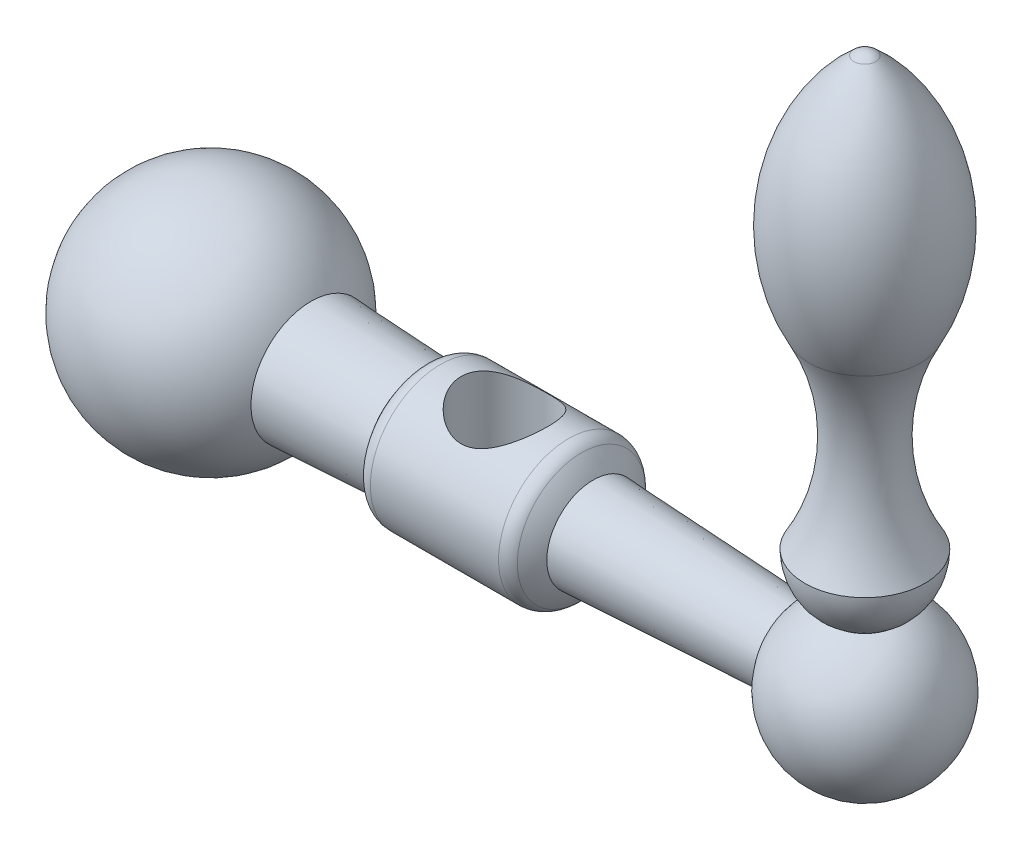
ISO-10303-21;
HEADER;
FILE_DESCRIPTION(('STEP AP214'),'2;1');
FILE_NAME('part.step','',(''),(''),'','','');
FILE_SCHEMA(('AUTOMOTIVE_DESIGN { 1 0 10303 214 1 1 1 1 }'));
ENDSEC;
DATA;
#1=APPLICATION_CONTEXT('core data for automotive mechanical design processes');
#2=APPLICATION_PROTOCOL_DEFINITION('international standard','automotive_design',2000,#1);
#3=PRODUCT_CONTEXT('',#1,'mechanical');
#4=PRODUCT('Part','Part','',(#3));
#5=PRODUCT_RELATED_PRODUCT_CATEGORY('part','',(#4));
#6=PRODUCT_DEFINITION_FORMATION('','',#4);
#7=PRODUCT_DEFINITION_CONTEXT('part definition',#1,'design');
#8=PRODUCT_DEFINITION('design','',#6,#7);
#9=PRODUCT_DEFINITION_SHAPE('','',#8);
#10=(LENGTH_UNIT() NAMED_UNIT(*) SI_UNIT(.MILLI.,.METRE.));
#11=(NAMED_UNIT(*) PLANE_ANGLE_UNIT() SI_UNIT($,.RADIAN.));
#12=(NAMED_UNIT(*) SI_UNIT($,.STERADIAN.) SOLID_ANGLE_UNIT());
#13=UNCERTAINTY_MEASURE_WITH_UNIT(LENGTH_MEASURE(1.E-05),#10,'distance_accuracy_value','');
#14=(GEOMETRIC_REPRESENTATION_CONTEXT(3) GLOBAL_UNCERTAINTY_ASSIGNED_CONTEXT((#13)) GLOBAL_UNIT_ASSIGNED_CONTEXT((#10,
#11,#12)) REPRESENTATION_CONTEXT('',''));
#15=CARTESIAN_POINT('',(0.,0.,0.));
#16=DIRECTION('',(0.,0.,1.));
#17=DIRECTION('',(1.,0.,0.));
#18=AXIS2_PLACEMENT_3D('',#15,#16,#17);
#19=CARTESIAN_POINT('',(59.,0.,0.));
#20=DIRECTION('',(1.,0.,0.));
#21=DIRECTION('',(0.,0.,-1.));
#22=AXIS2_PLACEMENT_3D('',#19,#20,#21);
#23=CYLINDRICAL_SURFACE('',#22,10.5);
#24=CARTESIAN_POINT('',(44.,-8.24621125123532,-6.5));
#25=CARTESIAN_POINT('',(43.8379980188743,-8.24621401991187,-6.49999825627353));
#26=CARTESIAN_POINT('',(43.67595666622,-8.25100603969613,-6.49393136943138));
#27=CARTESIAN_POINT('',(43.3532542932152,-8.2699634040029,-6.46977059674714));
#28=CARTESIAN_POINT('',(43.1925941994986,-8.28413460870234,-6.45166919162623));
#29=CARTESIAN_POINT('',(42.8737250401715,-8.32125973031101,-6.40371407115032));
#30=CARTESIAN_POINT('',(42.7155219066279,-8.34423224134673,-6.37383547076214));
#31=CARTESIAN_POINT('',(42.4029714895653,-8.39802209624007,-6.3027934071083));
#32=CARTESIAN_POINT('',(42.2486261674634,-8.42884334496442,-6.26162432586946));
#33=CARTESIAN_POINT('',(41.9461172998608,-8.49687600869094,-6.1689840563903));
#34=CARTESIAN_POINT('',(41.7979104838218,-8.5340271365491,-6.11760936563425));
#35=CARTESIAN_POINT('',(41.5068208620908,-8.61372921018179,-6.00486778536389));
#36=CARTESIAN_POINT('',(41.363940102934,-8.65628220450855,-5.94349710255254));
#37=CARTESIAN_POINT('',(40.9442140982525,-8.79019432059902,-5.74524861294803));
#38=CARTESIAN_POINT('',(40.6759953585964,-8.88787583798666,-5.59414426089783));
#39=CARTESIAN_POINT('',(40.1319818979779,-9.10446156256927,-5.2352801503978));
#40=CARTESIAN_POINT('',(39.8598162429305,-9.2244683250504,-5.02268658751902));
#41=CARTESIAN_POINT('',(39.4791478969429,-9.40349067632718,-4.67349890843906));
#42=CARTESIAN_POINT('',(39.3567748104676,-9.46304386747304,-4.55195226405779));
#43=CARTESIAN_POINT('',(39.1216816055063,-9.58058478400426,-4.29904811869782));
#44=CARTESIAN_POINT('',(39.0089633388145,-9.63857220762149,-4.16768874464251));
#45=CARTESIAN_POINT('',(38.7811343309393,-9.75838604625804,-3.87956626525839));
#46=CARTESIAN_POINT('',(38.6673106829732,-9.81985807951465,-3.72163454815858));
#47=CARTESIAN_POINT('',(38.4535670657032,-9.93755321238913,-3.39487436109188));
#48=CARTESIAN_POINT('',(38.3536408303658,-9.99377867378188,-3.22605085258338));
#49=CARTESIAN_POINT('',(38.168764010697,-10.0993841088951,-2.87844006810147));
#50=CARTESIAN_POINT('',(38.08380647439,-10.1487672581309,-2.69965746851921));
#51=CARTESIAN_POINT('',(37.9299715736879,-10.2392075476695,-2.33328236086308));
#52=CARTESIAN_POINT('',(37.8610913540014,-10.2802661662178,-2.14569142424701));
#53=CARTESIAN_POINT('',(37.7465562953786,-10.3490908893388,-1.78241309858795));
#54=CARTESIAN_POINT('',(37.69926638695,-10.377776376111,-1.6074148866985));
#55=CARTESIAN_POINT('',(37.6193110288899,-10.4265135362705,-1.25292097528043));
#56=CARTESIAN_POINT('',(37.5866446914058,-10.4465657338149,-1.07342554949377));
#57=CARTESIAN_POINT('',(37.5365018446877,-10.4774242101604,-0.711692069023873));
#58=CARTESIAN_POINT('',(37.5190123733152,-10.4882383787813,-0.529456490245124));
#59=CARTESIAN_POINT('',(37.4994883066961,-10.5003138484556,-0.163851094857709));
#60=CARTESIAN_POINT('',(37.4974519838835,-10.5015762173407,0.0195185926707281));
#61=CARTESIAN_POINT('',(37.5081068867207,-10.4949829749094,0.361375839524498));
#62=CARTESIAN_POINT('',(37.5188880248884,-10.4883098898778,0.519950264092169));
#63=CARTESIAN_POINT('',(37.5519671731413,-10.467901249293,0.835488664683756));
#64=CARTESIAN_POINT('',(37.5742689042163,-10.4541634119304,0.992452103666677));
#65=CARTESIAN_POINT('',(37.6300935672322,-10.4199435094164,1.30355753082128));
#66=CARTESIAN_POINT('',(37.6636125736919,-10.3994638036201,1.45770048614551));
#67=CARTESIAN_POINT('',(37.7414818068123,-10.3522023358701,1.76229212920199));
#68=CARTESIAN_POINT('',(37.7858362182341,-10.3254181391938,1.91273936483777));
#69=CARTESIAN_POINT('',(37.885031476537,-10.266024340067,2.209456261496));
#70=CARTESIAN_POINT('',(37.9399025570738,-10.233397960545,2.35571244545524));
#71=CARTESIAN_POINT('',(38.0595115520393,-10.1630248074604,2.64288118620176));
#72=CARTESIAN_POINT('',(38.1242529651835,-10.1252762187633,2.78379182595949));
#73=CARTESIAN_POINT('',(38.3324360887951,-10.0054152565924,3.197484477063));
#74=CARTESIAN_POINT('',(38.4899066510088,-9.91664478811862,3.46143391518601));
#75=CARTESIAN_POINT('',(38.85932861986,-9.71594170370635,3.99260332823852));
#76=CARTESIAN_POINT('',(39.0756036606733,-9.60250275017354,4.25621315883383));
#77=CARTESIAN_POINT('',(39.5455306255994,-9.37019136234932,4.74583538598213));
#78=CARTESIAN_POINT('',(39.7992360818771,-9.25131131713188,4.97179293079284));
#79=CARTESIAN_POINT('',(40.2219507098378,-9.06944282379994,5.29272932850314));
#80=CARTESIAN_POINT('',(40.3796602948143,-9.00468383159555,5.40186185859395));
#81=CARTESIAN_POINT('',(40.7052398137813,-8.87878916748879,5.6063802120581));
#82=CARTESIAN_POINT('',(40.8731115919796,-8.81765415726534,5.70176352957736));
#83=CARTESIAN_POINT('',(41.2180476599722,-8.70131838427941,5.87777018623488));
#84=CARTESIAN_POINT('',(41.395097707278,-8.64610881262744,5.95841556417005));
#85=CARTESIAN_POINT('',(41.7577437533369,-8.54385761750429,6.10413201608065));
#86=CARTESIAN_POINT('',(41.9433361305005,-8.49681257224537,6.16920961892516));
#87=CARTESIAN_POINT('',(42.2726837983772,-8.4240686265754,6.26799728336329));
#88=CARTESIAN_POINT('',(42.4147981287577,-8.39599841807482,6.30546488661885));
#89=CARTESIAN_POINT('',(42.7023293875016,-8.34649105509251,6.37085343726996));
#90=CARTESIAN_POINT('',(42.847745524705,-8.3250523292463,6.39877664642454));
#91=CARTESIAN_POINT('',(43.1408745106984,-8.28956922307199,6.44467891142459));
#92=CARTESIAN_POINT('',(43.2885846861025,-8.27551681624655,6.46266876263845));
#93=CARTESIAN_POINT('',(43.5854378041596,-8.25529760293418,6.48847692596812));
#94=CARTESIAN_POINT('',(43.7345807714928,-8.24913093252794,6.49629506255516));
#95=CARTESIAN_POINT('',(44.0334755402962,-8.2449224743347,6.50163562717883));
#96=CARTESIAN_POINT('',(44.1832279630475,-8.24689746928543,6.49913678840863));
#97=CARTESIAN_POINT('',(44.4818733019368,-8.25893058329497,6.4838382291818));
#98=CARTESIAN_POINT('',(44.6307662131827,-8.26898874831532,6.47103845015321));
#99=CARTESIAN_POINT('',(44.9266818337997,-8.29680867944639,6.43533034904476));
#100=CARTESIAN_POINT('',(45.0737035472855,-8.31457438454168,6.41241685818759));
#101=CARTESIAN_POINT('',(45.3648699007144,-8.35715739221055,6.35681802752489));
#102=CARTESIAN_POINT('',(45.5090133298124,-8.38197759828188,6.32412866386734));
#103=CARTESIAN_POINT('',(45.9321527218682,-8.46508072996143,6.21296600350431));
#104=CARTESIAN_POINT('',(46.2059310102852,-8.53242849616903,6.12088855461519));
#105=CARTESIAN_POINT('',(46.7346903731131,-8.6841257296935,5.90368048294253));
#106=CARTESIAN_POINT('',(46.989664651967,-8.76848130271656,5.77853798497041));
#107=CARTESIAN_POINT('',(47.5248271336837,-8.9638835663979,5.4715364689505));
#108=CARTESIAN_POINT('',(47.8007284035162,-9.07696562938918,5.283435691238));
#109=CARTESIAN_POINT('',(48.1899318831879,-9.24889208010986,4.97213753286427));
#110=CARTESIAN_POINT('',(48.3156484946296,-9.30663164933319,4.86341551126533));
#111=CARTESIAN_POINT('',(48.5585415308794,-9.42172248569805,4.63651877196199));
#112=CARTESIAN_POINT('',(48.6757163898747,-9.47907367990634,4.5183423294273));
#113=CARTESIAN_POINT('',(48.9182654894804,-9.60087035838565,4.25412395047678));
#114=CARTESIAN_POINT('',(49.0421454151421,-9.66505651370157,4.10658675172539));
#115=CARTESIAN_POINT('',(49.2769594708844,-9.78960682558596,3.80012396525616));
#116=CARTESIAN_POINT('',(49.3878985695189,-9.84997244492751,3.64120278642942));
#117=CARTESIAN_POINT('',(49.5958971547931,-9.96526837034554,3.31266171406678));
#118=CARTESIAN_POINT('',(49.6929579919786,-10.0201992051408,3.14304286387963));
#119=CARTESIAN_POINT('',(49.8721146984782,-10.1230603706026,2.79405185223684));
#120=CARTESIAN_POINT('',(49.9542125042012,-10.1709916069473,2.61468095672756));
#121=CARTESIAN_POINT('',(50.0976352104843,-10.2556336342195,2.25903666148545));
#122=CARTESIAN_POINT('',(50.1599453001586,-10.2928622374569,2.08328443992162));
#123=CARTESIAN_POINT('',(50.2695541928194,-10.3588315828111,1.72559234394429));
#124=CARTESIAN_POINT('',(50.3168534044051,-10.3875725559615,1.54365263810468));
#125=CARTESIAN_POINT('',(50.3956192345213,-10.4356587157646,1.1753617879848));
#126=CARTESIAN_POINT('',(50.4271032254685,-10.4550142111919,0.989015720654637));
#127=CARTESIAN_POINT('',(50.4737424491326,-10.4837493416343,0.613538766748698));
#128=CARTESIAN_POINT('',(50.4889002380532,-10.4931305383286,0.424408320826726));
#129=CARTESIAN_POINT('',(50.5016190698803,-10.5010017070804,0.0727370161630317));
#130=CARTESIAN_POINT('',(50.5014060073087,-10.5008693708711,-0.0896976622185156));
#131=CARTESIAN_POINT('',(50.4888354908576,-10.4930910506607,-0.413915105540586));
#132=CARTESIAN_POINT('',(50.4764785316412,-10.4854453727041,-0.575697896765216));
#133=CARTESIAN_POINT('',(50.4397937684331,-10.4628263968981,-0.897363497872473));
#134=CARTESIAN_POINT('',(50.4154668269888,-10.4478536270337,-1.0572464438064));
#135=CARTESIAN_POINT('',(50.3551693409802,-10.4109370410451,-1.37397791144453));
#136=CARTESIAN_POINT('',(50.3191985246189,-10.388993062196,-1.53082636222554));
#137=CARTESIAN_POINT('',(50.2373162983277,-10.339394804465,-1.83576824942859));
#138=CARTESIAN_POINT('',(50.191738784029,-10.3119335032397,-1.98398298202364));
#139=CARTESIAN_POINT('',(50.090535297607,-10.2514868499727,-2.27579910183524));
#140=CARTESIAN_POINT('',(50.0349060635344,-10.2184997049574,-2.41939897358236));
#141=CARTESIAN_POINT('',(49.8537332365041,-10.1121982648525,-2.84212139362489));
#142=CARTESIAN_POINT('',(49.7138422630189,-10.0315053419283,-3.1133952788527));
#143=CARTESIAN_POINT('',(49.3836688755313,-9.84698961313007,-3.65759430254854));
#144=CARTESIAN_POINT('',(49.1896326020992,-9.74162632332569,-3.92768868150249));
#145=CARTESIAN_POINT('',(48.764696150395,-9.52203534243025,-4.4336114081809));
#146=CARTESIAN_POINT('',(48.5337538060462,-9.40779758970765,-4.66939996479725));
#147=CARTESIAN_POINT('',(48.1453630597357,-9.22867435063609,-5.0101088622034));
#148=CARTESIAN_POINT('',(47.9989368500644,-9.16366000569898,-5.12774924816255));
#149=CARTESIAN_POINT('',(47.6959128953125,-9.03553537758892,-5.3502890894978));
#150=CARTESIAN_POINT('',(47.5393133217876,-8.97242543969398,-5.45518624477397));
#151=CARTESIAN_POINT('',(47.0551952418012,-8.78891701867843,-5.74962915487607));
#152=CARTESIAN_POINT('',(46.7129092310585,-8.67412268538842,-5.91932085782648));
#153=CARTESIAN_POINT('',(46.075085653213,-8.49907792810416,-6.16713678864583));
#154=CARTESIAN_POINT('',(45.7859838022629,-8.43237819597456,-6.25721731370114));
#155=CARTESIAN_POINT('',(45.3419343721982,-8.35341295350167,-6.36178672337956));
#156=CARTESIAN_POINT('',(45.1923440101775,-8.3306178888055,-6.39153637335166));
#157=CARTESIAN_POINT('',(44.8905135901587,-8.29280822406096,-6.4405213049873));
#158=CARTESIAN_POINT('',(44.73827501657,-8.2777894017553,-6.45976229283881));
#159=CARTESIAN_POINT('',(44.4881616880883,-8.26007829081354,-6.48237764439921));
#160=CARTESIAN_POINT('',(44.3907379967751,-8.2548874157793,-6.48898032505708));
#161=CARTESIAN_POINT('',(44.1955476997945,-8.24795267061786,-6.49779252590897));
#162=CARTESIAN_POINT('',(44.0977810215751,-8.24620958011982,-6.50000105247699));
#163=CARTESIAN_POINT('',(44.,-8.24621125123532,-6.5));
#164=B_SPLINE_CURVE_WITH_KNOTS('',3,(#24,#25,#26,#27,#28,#29,#30,#31,#32,#33,#34,#35,#36,#37,
#38,#39,#40,#41,#42,#43,#44,#45,#46,#47,#48,#49,#50,#51,#52,#53,#54,#55,#56,#57,#58,#59,#60,#61,
#62,#63,#64,#65,#66,#67,#68,#69,#70,#71,#72,#73,#74,#75,#76,#77,#78,#79,#80,#81,#82,#83,#84,#85,
#86,#87,#88,#89,#90,#91,#92,#93,#94,#95,#96,#97,#98,#99,#100,#101,#102,#103,#104,#105,#106,#107,
#108,#109,#110,#111,#112,#113,#114,#115,#116,#117,#118,#119,#120,#121,#122,#123,#124,#125,#126,
#127,#128,#129,#130,#131,#132,#133,#134,#135,#136,#137,#138,#139,#140,#141,#142,#143,#144,#145,
#146,#147,#148,#149,#150,#151,#152,#153,#154,#155,#156,#157,#158,#159,#160,#161,#162,#163),
.UNSPECIFIED.,.T.,.F.,(4,2,2,2,2,2,2,2,2,2,2,2,2,2,2,2,2,2,2,2,2,2,2,2,2,2,2,2,2,2,2,2,2,2,2,2,
2,2,2,2,2,2,2,2,2,2,2,2,2,2,2,2,2,2,2,2,2,2,2,2,2,2,2,2,2,2,2,2,2,4),(0.,0.485892760641778,
0.972089397263516,1.45931891494719,1.94679131195436,2.42985686874325,2.91310616905004,
3.87868062660727,4.97103169755911,5.51801743508842,6.06510785064015,6.67675303831126,
7.2881215484948,7.89920536545697,8.51018057274444,9.05997194158135,9.60972992595574,
10.159017913922,10.7082444940003,11.1849138690921,11.6617372980551,12.138394037031,
12.6152351583059,13.0934682569113,13.5718712696045,14.5280169951178,15.6020648803689,
16.6776640095516,17.2843115738561,17.8910695629147,18.4969126591456,19.1025012275409,
19.550941260889,19.9992749524819,20.4471204404311,20.8949736565491,21.343750511399,
21.7925299180475,22.2415389467717,22.6907330473074,23.5768832674901,24.4633521788292,
25.5166695514532,26.0441683146141,26.5717635331556,27.1801927787996,27.7883876473303,
28.3965232897948,29.0045801757132,29.5741926647196,30.143789647426,30.7127595738238,
31.2816404032845,31.7683324521798,32.2550046772381,32.7416418382128,33.2282903593211,
33.7002066330159,34.1722763272953,35.115703430024,36.1584177367208,37.2023320009071,
37.7980034049684,38.3937821659889,39.5834565922613,40.5096501838293,40.9717990289423,
41.4336966777902,41.7269051336823,42.0201798836659),.UNSPECIFIED.);
#165=CARTESIAN_POINT('',(44.,-8.24621125123532,-6.5));
#166=VERTEX_POINT('',#165);
#167=EDGE_CURVE('E62',#166,#166,#164,.T.);
#168=ORIENTED_EDGE('',*,*,#167,.T.);
#169=EDGE_LOOP('',(#168));
#170=FACE_BOUND('',#169,.T.);
#171=CARTESIAN_POINT('',(34.3953136438507,0.,0.));
#172=DIRECTION('',(1.,0.,0.));
#173=DIRECTION('',(0.,0.,-1.));
#174=AXIS2_PLACEMENT_3D('',#171,#172,#173);
#175=CIRCLE('',#174,10.5);
#176=CARTESIAN_POINT('',(34.3953136438507,0.,-10.5));
#177=VERTEX_POINT('',#176);
#178=EDGE_CURVE('E123',#177,#177,#175,.T.);
#179=ORIENTED_EDGE('',*,*,#178,.T.);
#180=EDGE_LOOP('',(#179));
#181=FACE_BOUND('',#180,.T.);
#182=CARTESIAN_POINT('',(53.6046863561493,0.,0.));
#183=DIRECTION('',(1.,0.,0.));
#184=DIRECTION('',(0.,0.,-1.));
#185=AXIS2_PLACEMENT_3D('',#182,#183,#184);
#186=CIRCLE('',#185,10.5);
#187=CARTESIAN_POINT('',(53.6046863561493,0.,-10.5));
#188=VERTEX_POINT('',#187);
#189=EDGE_CURVE('E126',#188,#188,#186,.T.);
#190=ORIENTED_EDGE('',*,*,#189,.F.);
#191=EDGE_LOOP('',(#190));
#192=FACE_BOUND('',#191,.T.);
#193=CARTESIAN_POINT('',(44.,8.24621125123532,-6.5));
#194=CARTESIAN_POINT('',(44.1620019811257,8.24621401991187,-6.49999825627353));
#195=CARTESIAN_POINT('',(44.32404333378,8.25100603969613,-6.49393136943138));
#196=CARTESIAN_POINT('',(44.6467457067848,8.2699634040029,-6.46977059674714));
#197=CARTESIAN_POINT('',(44.8074058005014,8.28413460870234,-6.45166919162623));
#198=CARTESIAN_POINT('',(45.1262749598285,8.32125973031101,-6.40371407115032));
#199=CARTESIAN_POINT('',(45.2844780933721,8.34423224134673,-6.37383547076214));
#200=CARTESIAN_POINT('',(45.5970285104347,8.39802209624007,-6.3027934071083));
#201=CARTESIAN_POINT('',(45.7513738325366,8.42884334496442,-6.26162432586946));
#202=CARTESIAN_POINT('',(46.0538827001392,8.49687600869094,-6.1689840563903));
#203=CARTESIAN_POINT('',(46.2020895161782,8.5340271365491,-6.11760936563425));
#204=CARTESIAN_POINT('',(46.4931791379092,8.61372921018179,-6.00486778536389));
#205=CARTESIAN_POINT('',(46.636059897066,8.65628220450855,-5.94349710255254));
#206=CARTESIAN_POINT('',(47.0557859017475,8.79019432059902,-5.74524861294803));
#207=CARTESIAN_POINT('',(47.3240046414036,8.88787583798666,-5.59414426089783));
#208=CARTESIAN_POINT('',(47.8680181020221,9.10446156256927,-5.2352801503978));
#209=CARTESIAN_POINT('',(48.1401837570695,9.2244683250504,-5.02268658751902));
#210=CARTESIAN_POINT('',(48.5208521030571,9.40349067632718,-4.67349890843906));
#211=CARTESIAN_POINT('',(48.6432251895324,9.46304386747305,-4.55195226405779));
#212=CARTESIAN_POINT('',(48.8783183944937,9.58058478400426,-4.29904811869781));
#213=CARTESIAN_POINT('',(48.9910366611855,9.63857220762149,-4.16768874464251));
#214=CARTESIAN_POINT('',(49.2188656690606,9.75838604625804,-3.87956626525839));
#215=CARTESIAN_POINT('',(49.3326893170268,9.81985807951465,-3.72163454815858));
#216=CARTESIAN_POINT('',(49.5464329342967,9.93755321238913,-3.39487436109188));
#217=CARTESIAN_POINT('',(49.6463591696342,9.99377867378188,-3.22605085258338));
#218=CARTESIAN_POINT('',(49.831235989303,10.0993841088951,-2.87844006810147));
#219=CARTESIAN_POINT('',(49.91619352561,10.1487672581309,-2.69965746851921));
#220=CARTESIAN_POINT('',(50.0700284263121,10.2392075476695,-2.33328236086308));
#221=CARTESIAN_POINT('',(50.1389086459986,10.2802661662178,-2.14569142424701));
#222=CARTESIAN_POINT('',(50.2534437046214,10.3490908893388,-1.78241309858795));
#223=CARTESIAN_POINT('',(50.30073361305,10.377776376111,-1.6074148866985));
#224=CARTESIAN_POINT('',(50.38068897111,10.4265135362705,-1.25292097528043));
#225=CARTESIAN_POINT('',(50.4133553085942,10.4465657338149,-1.07342554949377));
#226=CARTESIAN_POINT('',(50.4634981553123,10.4774242101604,-0.711692069023872));
#227=CARTESIAN_POINT('',(50.4809876266848,10.4882383787813,-0.529456490245123));
#228=CARTESIAN_POINT('',(50.5005116933038,10.5003138484556,-0.163851094857709));
#229=CARTESIAN_POINT('',(50.5025480161165,10.5015762173407,0.0195185926707282));
#230=CARTESIAN_POINT('',(50.4918931132793,10.4949829749094,0.361375839524498));
#231=CARTESIAN_POINT('',(50.4811119751116,10.4883098898778,0.519950264092169));
#232=CARTESIAN_POINT('',(50.4480328268587,10.467901249293,0.835488664683755));
#233=CARTESIAN_POINT('',(50.4257310957837,10.4541634119304,0.992452103666676));
#234=CARTESIAN_POINT('',(50.3699064327678,10.4199435094164,1.30355753082128));
#235=CARTESIAN_POINT('',(50.3363874263081,10.3994638036201,1.45770048614551));
#236=CARTESIAN_POINT('',(50.2585181931877,10.3522023358701,1.76229212920199));
#237=CARTESIAN_POINT('',(50.2141637817659,10.3254181391938,1.91273936483777));
#238=CARTESIAN_POINT('',(50.114968523463,10.266024340067,2.209456261496));
#239=CARTESIAN_POINT('',(50.0600974429262,10.233397960545,2.35571244545524));
#240=CARTESIAN_POINT('',(49.9404884479607,10.1630248074604,2.64288118620176));
#241=CARTESIAN_POINT('',(49.8757470348165,10.1252762187633,2.78379182595949));
#242=CARTESIAN_POINT('',(49.6675639112049,10.0054152565924,3.197484477063));
#243=CARTESIAN_POINT('',(49.5100933489912,9.91664478811862,3.46143391518601));
#244=CARTESIAN_POINT('',(49.14067138014,9.71594170370635,3.99260332823852));
#245=CARTESIAN_POINT('',(48.9243963393267,9.60250275017354,4.25621315883383));
#246=CARTESIAN_POINT('',(48.4544693744006,9.37019136234932,4.74583538598213));
#247=CARTESIAN_POINT('',(48.2007639181229,9.25131131713188,4.97179293079284));
#248=CARTESIAN_POINT('',(47.7780492901622,9.06944282379994,5.29272932850314));
#249=CARTESIAN_POINT('',(47.6203397051857,9.00468383159555,5.40186185859395));
#250=CARTESIAN_POINT('',(47.2947601862187,8.87878916748879,5.6063802120581));
#251=CARTESIAN_POINT('',(47.1268884080204,8.81765415726534,5.70176352957736));
#252=CARTESIAN_POINT('',(46.7819523400278,8.70131838427941,5.87777018623488));
#253=CARTESIAN_POINT('',(46.604902292722,8.64610881262744,5.95841556417005));
#254=CARTESIAN_POINT('',(46.2422562466631,8.54385761750428,6.10413201608066));
#255=CARTESIAN_POINT('',(46.0566638694995,8.49681257224537,6.16920961892516));
#256=CARTESIAN_POINT('',(45.7273162016228,8.4240686265754,6.26799728336329));
#257=CARTESIAN_POINT('',(45.5852018712423,8.39599841807482,6.30546488661885));
#258=CARTESIAN_POINT('',(45.2976706124984,8.34649105509251,6.37085343726996));
#259=CARTESIAN_POINT('',(45.152254475295,8.3250523292463,6.39877664642454));
#260=CARTESIAN_POINT('',(44.8591254893016,8.28956922307199,6.44467891142459));
#261=CARTESIAN_POINT('',(44.7114153138975,8.27551681624655,6.46266876263845));
#262=CARTESIAN_POINT('',(44.4145621958404,8.25529760293418,6.48847692596812));
#263=CARTESIAN_POINT('',(44.2654192285072,8.24913093252794,6.49629506255516));
#264=CARTESIAN_POINT('',(43.9665244597038,8.2449224743347,6.50163562717883));
#265=CARTESIAN_POINT('',(43.8167720369525,8.24689746928543,6.49913678840863));
#266=CARTESIAN_POINT('',(43.5181266980632,8.25893058329497,6.4838382291818));
#267=CARTESIAN_POINT('',(43.3692337868173,8.26898874831532,6.47103845015321));
#268=CARTESIAN_POINT('',(43.0733181662003,8.29680867944639,6.43533034904476));
#269=CARTESIAN_POINT('',(42.9262964527145,8.31457438454168,6.41241685818759));
#270=CARTESIAN_POINT('',(42.6351300992856,8.35715739221055,6.35681802752489));
#271=CARTESIAN_POINT('',(42.4909866701877,8.38197759828188,6.32412866386734));
#272=CARTESIAN_POINT('',(42.0678472781318,8.46508072996143,6.21296600350431));
#273=CARTESIAN_POINT('',(41.7940689897148,8.53242849616903,6.12088855461519));
#274=CARTESIAN_POINT('',(41.2653096268869,8.6841257296935,5.90368048294253));
#275=CARTESIAN_POINT('',(41.010335348033,8.76848130271656,5.77853798497041));
#276=CARTESIAN_POINT('',(40.4751728663163,8.9638835663979,5.4715364689505));
#277=CARTESIAN_POINT('',(40.1992715964838,9.07696562938918,5.283435691238));
#278=CARTESIAN_POINT('',(39.8100681168121,9.24889208010986,4.97213753286427));
#279=CARTESIAN_POINT('',(39.6843515053704,9.30663164933319,4.86341551126533));
#280=CARTESIAN_POINT('',(39.4414584691206,9.42172248569805,4.63651877196199));
#281=CARTESIAN_POINT('',(39.3242836101253,9.47907367990634,4.5183423294273));
#282=CARTESIAN_POINT('',(39.0817345105196,9.60087035838565,4.25412395047679));
#283=CARTESIAN_POINT('',(38.9578545848579,9.66505651370157,4.10658675172539));
#284=CARTESIAN_POINT('',(38.7230405291156,9.78960682558596,3.80012396525617));
#285=CARTESIAN_POINT('',(38.6121014304811,9.84997244492751,3.64120278642942));
#286=CARTESIAN_POINT('',(38.4041028452069,9.96526837034554,3.31266171406678));
#287=CARTESIAN_POINT('',(38.3070420080214,10.0201992051408,3.14304286387963));
#288=CARTESIAN_POINT('',(38.1278853015218,10.1230603706026,2.79405185223684));
#289=CARTESIAN_POINT('',(38.0457874957988,10.1709916069473,2.61468095672756));
#290=CARTESIAN_POINT('',(37.9023647895157,10.2556336342195,2.25903666148545));
#291=CARTESIAN_POINT('',(37.8400546998414,10.2928622374569,2.08328443992162));
#292=CARTESIAN_POINT('',(37.7304458071806,10.3588315828111,1.72559234394429));
#293=CARTESIAN_POINT('',(37.6831465955949,10.3875725559615,1.54365263810468));
#294=CARTESIAN_POINT('',(37.6043807654787,10.4356587157646,1.1753617879848));
#295=CARTESIAN_POINT('',(37.5728967745315,10.4550142111919,0.989015720654636));
#296=CARTESIAN_POINT('',(37.5262575508674,10.4837493416343,0.613538766748697));
#297=CARTESIAN_POINT('',(37.5110997619468,10.4931305383286,0.424408320826725));
#298=CARTESIAN_POINT('',(37.4983809301197,10.5010017070804,0.0727370161630339));
#299=CARTESIAN_POINT('',(37.4985939926913,10.5008693708711,-0.0896976622185112));
#300=CARTESIAN_POINT('',(37.5111645091424,10.4930910506607,-0.413915105540581));
#301=CARTESIAN_POINT('',(37.5235214683588,10.4854453727041,-0.575697896765214));
#302=CARTESIAN_POINT('',(37.5602062315669,10.4628263968981,-0.897363497872473));
#303=CARTESIAN_POINT('',(37.5845331730112,10.4478536270337,-1.0572464438064));
#304=CARTESIAN_POINT('',(37.6448306590198,10.4109370410451,-1.37397791144453));
#305=CARTESIAN_POINT('',(37.680801475381,10.388993062196,-1.53082636222554));
#306=CARTESIAN_POINT('',(37.7626837016723,10.339394804465,-1.83576824942859));
#307=CARTESIAN_POINT('',(37.808261215971,10.3119335032397,-1.98398298202364));
#308=CARTESIAN_POINT('',(37.909464702393,10.2514868499727,-2.27579910183524));
#309=CARTESIAN_POINT('',(37.9650939364656,10.2184997049574,-2.41939897358236));
#310=CARTESIAN_POINT('',(38.1462667634959,10.1121982648525,-2.84212139362489));
#311=CARTESIAN_POINT('',(38.286157736981,10.0315053419283,-3.1133952788527));
#312=CARTESIAN_POINT('',(38.6163311244687,9.84698961313007,-3.65759430254854));
#313=CARTESIAN_POINT('',(38.8103673979008,9.74162632332568,-3.92768868150249));
#314=CARTESIAN_POINT('',(39.235303849605,9.52203534243024,-4.4336114081809));
#315=CARTESIAN_POINT('',(39.4662461939538,9.40779758970765,-4.66939996479725));
#316=CARTESIAN_POINT('',(39.8546369402643,9.22867435063609,-5.0101088622034));
#317=CARTESIAN_POINT('',(40.0010631499355,9.16366000569898,-5.12774924816255));
#318=CARTESIAN_POINT('',(40.3040871046875,9.03553537758892,-5.3502890894978));
#319=CARTESIAN_POINT('',(40.4606866782124,8.97242543969398,-5.45518624477397));
#320=CARTESIAN_POINT('',(40.9448047581988,8.78891701867843,-5.74962915487607));
#321=CARTESIAN_POINT('',(41.2870907689415,8.67412268538842,-5.91932085782648));
#322=CARTESIAN_POINT('',(41.924914346787,8.49907792810416,-6.16713678864583));
#323=CARTESIAN_POINT('',(42.2140161977371,8.43237819597456,-6.25721731370114));
#324=CARTESIAN_POINT('',(42.6580656278018,8.35341295350167,-6.36178672337956));
#325=CARTESIAN_POINT('',(42.8076559898225,8.3306178888055,-6.39153637335166));
#326=CARTESIAN_POINT('',(43.1094864098413,8.29280822406096,-6.4405213049873));
#327=CARTESIAN_POINT('',(43.26172498343,8.2777894017553,-6.45976229283881));
#328=CARTESIAN_POINT('',(43.5118383119117,8.26007829081354,-6.48237764439921));
#329=CARTESIAN_POINT('',(43.6092620032249,8.2548874157793,-6.48898032505708));
#330=CARTESIAN_POINT('',(43.8044523002055,8.24795267061786,-6.49779252590897));
#331=CARTESIAN_POINT('',(43.9022189784249,8.24620958011982,-6.50000105247699));
#332=CARTESIAN_POINT('',(44.,8.24621125123532,-6.5));
#333=B_SPLINE_CURVE_WITH_KNOTS('',3,(#193,#194,#195,#196,#197,#198,#199,#200,#201,#202,#203,
#204,#205,#206,#207,#208,#209,#210,#211,#212,#213,#214,#215,#216,#217,#218,#219,#220,#221,#222,
#223,#224,#225,#226,#227,#228,#229,#230,#231,#232,#233,#234,#235,#236,#237,#238,#239,#240,#241,
#242,#243,#244,#245,#246,#247,#248,#249,#250,#251,#252,#253,#254,#255,#256,#257,#258,#259,#260,
#261,#262,#263,#264,#265,#266,#267,#268,#269,#270,#271,#272,#273,#274,#275,#276,#277,#278,#279,
#280,#281,#282,#283,#284,#285,#286,#287,#288,#289,#290,#291,#292,#293,#294,#295,#296,#297,#298,
#299,#300,#301,#302,#303,#304,#305,#306,#307,#308,#309,#310,#311,#312,#313,#314,#315,#316,#317,
#318,#319,#320,#321,#322,#323,#324,#325,#326,#327,#328,#329,#330,#331,#332),.UNSPECIFIED.,.T.,
.F.,(4,2,2,2,2,2,2,2,2,2,2,2,2,2,2,2,2,2,2,2,2,2,2,2,2,2,2,2,2,2,2,2,2,2,2,2,2,2,2,2,2,2,2,2,2,
2,2,2,2,2,2,2,2,2,2,2,2,2,2,2,2,2,2,2,2,2,2,2,2,4),(0.,0.485892760641778,0.972089397263516,
1.45931891494719,1.94679131195436,2.42985686874325,2.91310616905004,3.87868062660727,
4.97103169755911,5.51801743508843,6.06510785064015,6.67675303831126,7.2881215484948,
7.89920536545697,8.51018057274444,9.05997194158135,9.60972992595574,10.159017913922,
10.7082444940003,11.1849138690921,11.6617372980551,12.138394037031,12.6152351583059,
13.0934682569113,13.5718712696045,14.5280169951178,15.6020648803689,16.6776640095516,
17.2843115738561,17.8910695629147,18.4969126591456,19.1025012275409,19.550941260889,
19.9992749524819,20.4471204404311,20.8949736565491,21.343750511399,21.7925299180475,
22.2415389467716,22.6907330473074,23.5768832674901,24.4633521788292,25.5166695514532,
26.0441683146141,26.5717635331556,27.1801927787996,27.7883876473303,28.3965232897948,
29.0045801757132,29.5741926647196,30.143789647426,30.7127595738238,31.2816404032845,
31.7683324521798,32.2550046772381,32.7416418382128,33.2282903593211,33.7002066330159,
34.1722763272953,35.115703430024,36.1584177367208,37.2023320009071,37.7980034049684,
38.393782165989,39.5834565922613,40.5096501838293,40.9717990289423,41.4336966777902,
41.7269051336823,42.0201798836659),.UNSPECIFIED.);
#334=CARTESIAN_POINT('',(44.,8.24621125123532,-6.5));
#335=VERTEX_POINT('',#334);
#336=EDGE_CURVE('E41',#335,#335,#333,.T.);
#337=ORIENTED_EDGE('',*,*,#336,.T.);
#338=EDGE_LOOP('',(#337));
#339=FACE_BOUND('',#338,.T.);
#340=ADVANCED_FACE('F40',(#170,#181,#192,#339),#23,.T.);
#341=CARTESIAN_POINT('',(87.3346354961492,0.,0.));
#342=DIRECTION('',(-1.,0.,0.));
#343=DIRECTION('',(0.,0.,1.));
#344=AXIS2_PLACEMENT_3D('',#341,#342,#343);
#345=CONICAL_SURFACE('',#344,5.5,0.0483540780497947);
#346=CARTESIAN_POINT('',(57.2907326214615,0.,0.));
#347=DIRECTION('',(-1.,0.,0.));
#348=DIRECTION('',(0.,0.,1.));
#349=AXIS2_PLACEMENT_3D('',#346,#347,#348);
#350=CIRCLE('',#349,6.95387851380956);
#351=CARTESIAN_POINT('',(57.2907326214615,-6.95387851380934,0.));
#352=VERTEX_POINT('',#351);
#353=EDGE_CURVE('E10',#352,#352,#350,.T.);
#354=ORIENTED_EDGE('',*,*,#353,.F.);
#355=EDGE_LOOP('',(#354));
#356=FACE_BOUND('',#355,.T.);
#357=CARTESIAN_POINT('',(87.3346354961492,0.,0.));
#358=DIRECTION('',(1.,0.,0.));
#359=DIRECTION('',(0.,0.,-1.));
#360=AXIS2_PLACEMENT_3D('',#357,#358,#359);
#361=CIRCLE('',#360,5.5);
#362=CARTESIAN_POINT('',(87.3346354961492,0.,-5.5));
#363=VERTEX_POINT('',#362);
#364=EDGE_CURVE('E54',#363,#363,#361,.T.);
#365=ORIENTED_EDGE('',*,*,#364,.F.);
#366=EDGE_LOOP('',(#365));
#367=FACE_BOUND('',#366,.T.);
#368=ADVANCED_FACE('F114',(#356,#367),#345,.T.);
#369=CARTESIAN_POINT('',(44.,0.,0.));
#370=DIRECTION('',(1.,0.,0.));
#371=DIRECTION('',(0.,-1.,0.));
#372=AXIS2_PLACEMENT_3D('',#369,#370,#371);
#373=SPHERICAL_SURFACE('',#372,15.);
#374=CARTESIAN_POINT('',(55.5256236273791,0.,0.));
#375=DIRECTION('',(1.,0.,0.));
#376=DIRECTION('',(0.,0.,-1.));
#377=AXIS2_PLACEMENT_3D('',#374,#375,#376);
#378=CIRCLE('',#377,9.6);
#379=CARTESIAN_POINT('',(55.5256236273791,-9.6,0.));
#380=VERTEX_POINT('',#379);
#381=EDGE_CURVE('E145',#380,#380,#378,.T.);
#382=CARTESIAN_POINT('',(57.2907326214615,-6.95387851380934,0.));
#383=CARTESIAN_POINT('',(57.2753432910655,-6.9832916681052,0.));
#384=CARTESIAN_POINT('',(57.25985631815,-7.01265373458386,0.));
#385=CARTESIAN_POINT('',(57.2286877766869,-7.07127440126945,0.));
#386=CARTESIAN_POINT('',(57.2130062081391,-7.10053300147638,0.));
#387=CARTESIAN_POINT('',(57.1814491648178,-7.15894544498116,0.));
#388=CARTESIAN_POINT('',(57.1655736900442,-7.18809928827902,0.));
#389=CARTESIAN_POINT('',(57.1336295345231,-7.24630093316788,0.));
#390=CARTESIAN_POINT('',(57.1175608537756,-7.27534873475889,0.));
#391=CARTESIAN_POINT('',(57.0852309944591,-7.33333701578296,0.));
#392=CARTESIAN_POINT('',(57.06896981589,-7.36227749521603,0.));
#393=CARTESIAN_POINT('',(57.0362556777324,-7.42004985629149,0.));
#394=CARTESIAN_POINT('',(57.019802718144,-7.44888173793387,0.));
#395=CARTESIAN_POINT('',(56.9867057431594,-7.50643563255854,0.));
#396=CARTESIAN_POINT('',(56.9700617277632,-7.53515764554081,0.));
#397=CARTESIAN_POINT('',(56.9365833748078,-7.59249053682495,0.));
#398=CARTESIAN_POINT('',(56.9197490372486,-7.62110141512682,0.));
#399=CARTESIAN_POINT('',(56.8858907819979,-7.6782107759268,0.));
#400=CARTESIAN_POINT('',(56.8688668643064,-7.70670925842492,0.));
#401=CARTESIAN_POINT('',(56.8346301991791,-7.76359257144875,0.));
#402=CARTESIAN_POINT('',(56.8174174517433,-7.79197740197447,0.));
#403=CARTESIAN_POINT('',(56.7828038858385,-7.84863215989432,0.));
#404=CARTESIAN_POINT('',(56.7654030673695,-7.87690208728846,0.));
#405=CARTESIAN_POINT('',(56.7304141263992,-7.93332579285078,0.));
#406=CARTESIAN_POINT('',(56.7128260038979,-7.96147957101895,0.));
#407=CARTESIAN_POINT('',(56.6774632301202,-8.0176697371546,0.));
#408=CARTESIAN_POINT('',(56.6596885788438,-8.04570612512209,0.));
#409=CARTESIAN_POINT('',(56.6239535309947,-8.10166027505603,0.));
#410=CARTESIAN_POINT('',(56.6059931344221,-8.12957803702248,0.));
#411=CARTESIAN_POINT('',(56.5698873876469,-8.18529370438286,0.));
#412=CARTESIAN_POINT('',(56.5517420374444,-8.21309160977679,0.));
#413=CARTESIAN_POINT('',(56.5152671832283,-8.26856633870373,0.));
#414=CARTESIAN_POINT('',(56.4969376792147,-8.29624316223673,0.));
#415=CARTESIAN_POINT('',(56.4600953253124,-8.35147450749052,0.));
#416=CARTESIAN_POINT('',(56.4415824754237,-8.3790290292113,0.));
#417=CARTESIAN_POINT('',(56.4043742457888,-8.4340145562802,0.));
#418=CARTESIAN_POINT('',(56.3856788660426,-8.46144556162831,0.));
#419=CARTESIAN_POINT('',(56.3481064007561,-8.51618284683588,0.));
#420=CARTESIAN_POINT('',(56.3292293152157,-8.54348912669533,0.));
#421=CARTESIAN_POINT('',(56.2912942704132,-8.59797575730724,0.));
#422=CARTESIAN_POINT('',(56.2722363111511,-8.62515610805969,0.));
#423=CARTESIAN_POINT('',(56.2339403589504,-8.67938968239006,0.));
#424=CARTESIAN_POINT('',(56.2147023660118,-8.70644290596798,0.));
#425=CARTESIAN_POINT('',(56.1760471944389,-8.76042103348528,0.));
#426=CARTESIAN_POINT('',(56.1566300158046,-8.78734593742466,0.));
#427=CARTESIAN_POINT('',(56.1176173287192,-8.84106623885704,0.));
#428=CARTESIAN_POINT('',(56.0980218202682,-8.86786163635003,0.));
#429=CARTESIAN_POINT('',(56.058653337289,-8.92132174379024,0.));
#430=CARTESIAN_POINT('',(56.0388803627608,-8.94798645373746,0.));
#431=CARTESIAN_POINT('',(55.999157819189,-9.00118401074709,0.));
#432=CARTESIAN_POINT('',(55.9792082501454,-9.02771685780949,0.));
#433=CARTESIAN_POINT('',(55.9391333968894,-9.08064951952337,0.));
#434=CARTESIAN_POINT('',(55.919008112677,-9.10704933417485,0.));
#435=CARTESIAN_POINT('',(55.8785827161723,-9.15971476740233,0.));
#436=CARTESIAN_POINT('',(55.85828260388,-9.18598038597833,0.));
#437=CARTESIAN_POINT('',(55.8175084460212,-9.23837626931401,0.));
#438=CARTESIAN_POINT('',(55.7970344004547,-9.26450653407369,0.));
#439=CARTESIAN_POINT('',(55.7559132784808,-9.31663055797022,0.));
#440=CARTESIAN_POINT('',(55.7352662020735,-9.34262431710709,0.));
#441=CARTESIAN_POINT('',(55.6937999286229,-9.39447418408714,0.));
#442=CARTESIAN_POINT('',(55.6729807315797,-9.42033029193033,0.));
#443=CARTESIAN_POINT('',(55.6311711341102,-9.47190371627682,0.));
#444=CARTESIAN_POINT('',(55.6101807336839,-9.49762103278012,0.));
#445=CARTESIAN_POINT('',(55.5680296562586,-9.5489157421709,0.));
#446=CARTESIAN_POINT('',(55.5468689792595,-9.57449313505838,0.));
#447=CARTESIAN_POINT('',(55.5256236273791,-9.6,0.));
#448=B_SPLINE_CURVE_WITH_KNOTS('',3,(#382,#383,#384,#385,#386,#387,#388,#389,#390,#391,#392,
#393,#394,#395,#396,#397,#398,#399,#400,#401,#402,#403,#404,#405,#406,#407,#408,#409,#410,#411,
#412,#413,#414,#415,#416,#417,#418,#419,#420,#421,#422,#423,#424,#425,#426,#427,#428,#429,#430,
#431,#432,#433,#434,#435,#436,#437,#438,#439,#440,#441,#442,#443,#444,#445,#446,#447),
.UNSPECIFIED.,.F.,.F.,(4,2,2,2,2,2,2,2,2,2,2,2,2,2,2,2,2,2,2,2,2,2,2,2,2,2,2,2,2,2,2,2,4),(0.,
0.0995873977196108,0.199174795439221,0.298762193158835,0.398349590878446,0.497936988598054,
0.597524386317666,0.697111784037276,0.796699181756888,0.896286579476499,0.99587397719611,
1.09546137491572,1.19504877263533,1.29463617035494,1.39422356807455,1.49381096579416,
1.59339836351377,1.69298576123338,1.79257315895299,1.89216055667261,1.99174795439222,
2.09133535211183,2.19092274983143,2.29051014755105,2.39009754527066,2.48968494299027,
2.58927234070988,2.68885973842949,2.7884471361491,2.88803453386871,2.98762193158833,
3.08720932930794,3.18679672702755),.UNSPECIFIED.);
#449=EDGE_CURVE('BSEAM107',#352,#380,#448,.T.);
#450=ORIENTED_EDGE('',*,*,#353,.T.);
#451=ORIENTED_EDGE('',*,*,#381,.T.);
#452=ORIENTED_EDGE('',*,*,#449,.T.);
#453=ORIENTED_EDGE('',*,*,#449,.F.);
#454=EDGE_LOOP('',(#450,#452,#451,#453));
#455=FACE_BOUND('',#454,.T.);
#456=ADVANCED_FACE('F107',(#455),#373,.T.);
#457=CARTESIAN_POINT('',(53.6046863561493,0.,0.));
#458=DIRECTION('',(1.,0.,0.));
#459=DIRECTION('',(0.,0.,-1.));
#460=AXIS2_PLACEMENT_3D('',#457,#458,#459);
#461=TOROIDAL_SURFACE('',#460,8.,2.5);
#462=ORIENTED_EDGE('',*,*,#189,.T.);
#463=EDGE_LOOP('',(#462));
#464=FACE_BOUND('',#463,.T.);
#465=ORIENTED_EDGE('',*,*,#381,.F.);
#466=EDGE_LOOP('',(#465));
#467=FACE_BOUND('',#466,.T.);
#468=ADVANCED_FACE('F103',(#464,#467),#461,.T.);
#469=CARTESIAN_POINT('',(34.3953136438507,0.,0.));
#470=DIRECTION('',(1.,0.,0.));
#471=DIRECTION('',(0.,0.,-1.));
#472=AXIS2_PLACEMENT_3D('',#469,#470,#471);
#473=TOROIDAL_SURFACE('',#472,8.,2.5);
#474=CARTESIAN_POINT('',(32.4743763726209,0.,0.));
#475=DIRECTION('',(1.,0.,0.));
#476=DIRECTION('',(0.,0.,-1.));
#477=AXIS2_PLACEMENT_3D('',#474,#475,#476);
#478=CIRCLE('',#477,9.6);
#479=CARTESIAN_POINT('',(32.4743763726209,9.6,0.));
#480=VERTEX_POINT('',#479);
#481=EDGE_CURVE('E61',#480,#480,#478,.T.);
#482=ORIENTED_EDGE('',*,*,#481,.T.);
#483=EDGE_LOOP('',(#482));
#484=FACE_BOUND('',#483,.T.);
#485=ORIENTED_EDGE('',*,*,#178,.F.);
#486=EDGE_LOOP('',(#485));
#487=FACE_BOUND('',#486,.T.);
#488=ADVANCED_FACE('F99',(#484,#487),#473,.T.);
#489=CARTESIAN_POINT('',(44.,0.,0.));
#490=DIRECTION('',(1.,0.,0.));
#491=DIRECTION('',(0.,1.,0.));
#492=AXIS2_PLACEMENT_3D('',#489,#490,#491);
#493=SPHERICAL_SURFACE('',#492,15.);
#494=CARTESIAN_POINT('',(31.4428185355562,0.,0.));
#495=DIRECTION('',(1.,0.,0.));
#496=DIRECTION('',(0.,0.,-1.));
#497=AXIS2_PLACEMENT_3D('',#494,#495,#496);
#498=CIRCLE('',#497,8.2047055808866);
#499=CARTESIAN_POINT('',(31.4428185355562,8.20470558088644,0.));
#500=VERTEX_POINT('',#499);
#501=EDGE_CURVE('E49',#500,#500,#498,.T.);
#502=CARTESIAN_POINT('',(31.4428185355562,8.20470558088644,0.));
#503=CARTESIAN_POINT('',(31.4527107907693,8.21984553257446,0.));
#504=CARTESIAN_POINT('',(31.4626304271563,8.23496759374426,0.));
#505=CARTESIAN_POINT('',(31.4825243319356,8.265175737577,0.));
#506=CARTESIAN_POINT('',(31.492498600328,8.28026182023996,0.));
#507=CARTESIAN_POINT('',(31.5125016387763,8.31039780958863,0.));
#508=CARTESIAN_POINT('',(31.522530408832,8.32544771627436,0.));
#509=CARTESIAN_POINT('',(31.5426423193603,8.35551115679761,0.));
#510=CARTESIAN_POINT('',(31.5527254598328,8.37052469063514,0.));
#511=CARTESIAN_POINT('',(31.5729459792878,8.4005151890331,0.));
#512=CARTESIAN_POINT('',(31.5830833582704,8.41549215359353,0.));
#513=CARTESIAN_POINT('',(31.6034122221154,8.44540931749587,0.));
#514=CARTESIAN_POINT('',(31.6136037069779,8.46034951683779,0.));
#515=CARTESIAN_POINT('',(31.6340406492487,8.49019295484029,0.));
#516=CARTESIAN_POINT('',(31.644286106657,8.50509619350086,0.));
#517=CARTESIAN_POINT('',(31.6648308599781,8.53486551516203,0.));
#518=CARTESIAN_POINT('',(31.6751301558909,8.54973159816262,0.));
#519=CARTESIAN_POINT('',(31.6957824514755,8.57942641401113,0.));
#520=CARTESIAN_POINT('',(31.7061354511473,8.59425514685904,0.));
#521=CARTESIAN_POINT('',(31.7268950188019,8.62387506839819,0.));
#522=CARTESIAN_POINT('',(31.7373015867846,8.63866625708942,0.));
#523=CARTESIAN_POINT('',(31.7581681549122,8.66821089680238,0.));
#524=CARTESIAN_POINT('',(31.7686281550569,8.68296434782411,0.));
#525=CARTESIAN_POINT('',(31.7896014506606,8.71243331917896,0.));
#526=CARTESIAN_POINT('',(31.8001147461194,8.72714883951208,0.));
#527=CARTESIAN_POINT('',(31.8211944948059,8.75654175696687,0.));
#528=CARTESIAN_POINT('',(31.8317609480336,8.77121915408853,0.));
#529=CARTESIAN_POINT('',(31.852946874017,8.8005356330963,0.));
#530=CARTESIAN_POINT('',(31.8635663467728,8.81517471498241,0.));
#531=CARTESIAN_POINT('',(31.8848581728782,8.84441437199627,0.));
#532=CARTESIAN_POINT('',(31.8955305262278,8.85901494712402,0.));
#533=CARTESIAN_POINT('',(31.9169279738945,8.88817739960213,0.));
#534=CARTESIAN_POINT('',(31.9276530682117,8.90273927695249,0.));
#535=CARTESIAN_POINT('',(31.9491558574975,8.93182414336307,0.));
#536=CARTESIAN_POINT('',(31.9599335524661,8.9463471324233,0.));
#537=CARTESIAN_POINT('',(31.9815414020503,8.97535403224964,0.));
#538=CARTESIAN_POINT('',(31.992371556666,8.98983794301575,0.));
#539=CARTESIAN_POINT('',(32.0140841838536,9.01876649676116,0.));
#540=CARTESIAN_POINT('',(32.0249666564256,9.03321113974045,0.));
#541=CARTESIAN_POINT('',(32.0467837771507,9.06206096893325,0.));
#542=CARTESIAN_POINT('',(32.0577184253039,9.07646615514675,0.));
#543=CARTESIAN_POINT('',(32.0796397541337,9.10523688234521,0.));
#544=CARTESIAN_POINT('',(32.0906264348102,9.11960242333016,0.));
#545=CARTESIAN_POINT('',(32.1126516849483,9.14829367212743,0.));
#546=CARTESIAN_POINT('',(32.1236902544097,9.16261937993975,0.));
#547=CARTESIAN_POINT('',(32.1458191377001,9.19123077496882,0.));
#548=CARTESIAN_POINT('',(32.1569094515291,9.20551646218556,0.));
#549=CARTESIAN_POINT('',(32.1791416784602,9.23404762912411,0.));
#550=CARTESIAN_POINT('',(32.1902835915623,9.24829310884592,0.));
#551=CARTESIAN_POINT('',(32.2126188712702,9.27674367442127,0.));
#552=CARTESIAN_POINT('',(32.2238122378761,9.29094876027481,0.));
#553=CARTESIAN_POINT('',(32.2462502781488,9.31931835226883,0.));
#554=CARTESIAN_POINT('',(32.2574949518158,9.3334828584093,0.));
#555=CARTESIAN_POINT('',(32.2800354590971,9.36177110566306,0.));
#556=CARTESIAN_POINT('',(32.2913312927115,9.37589484677635,0.));
#557=CARTESIAN_POINT('',(32.3139739721039,9.40410137919572,0.));
#558=CARTESIAN_POINT('',(32.3253208178818,9.4181841705018,0.));
#559=CARTESIAN_POINT('',(32.3480653731535,9.44630861905967,0.));
#560=CARTESIAN_POINT('',(32.3594630826471,9.46035027631146,0.));
#561=CARTESIAN_POINT('',(32.3823092162241,9.4883922730623,0.));
#562=CARTESIAN_POINT('',(32.3937576403075,9.50239261256135,0.));
#563=CARTESIAN_POINT('',(32.4167050533217,9.53035179060968,0.));
#564=CARTESIAN_POINT('',(32.4282040422526,9.54431062915895,0.));
#565=CARTESIAN_POINT('',(32.4512524343815,9.57218662279976,0.));
#566=CARTESIAN_POINT('',(32.4628018375795,9.5861037778913,0.));
#567=CARTESIAN_POINT('',(32.4743763726209,9.6,0.));
#568=B_SPLINE_CURVE_WITH_KNOTS('',3,(#502,#503,#504,#505,#506,#507,#508,#509,#510,#511,#512,
#513,#514,#515,#516,#517,#518,#519,#520,#521,#522,#523,#524,#525,#526,#527,#528,#529,#530,#531,
#532,#533,#534,#535,#536,#537,#538,#539,#540,#541,#542,#543,#544,#545,#546,#547,#548,#549,#550,
#551,#552,#553,#554,#555,#556,#557,#558,#559,#560,#561,#562,#563,#564,#565,#566,#567),
.UNSPECIFIED.,.F.,.F.,(4,2,2,2,2,2,2,2,2,2,2,2,2,2,2,2,2,2,2,2,2,2,2,2,2,2,2,2,2,2,2,2,4),(0.,
0.0542556028751433,0.108511205750288,0.162766808625433,0.217022411500575,0.271278014375722,
0.325533617250865,0.379789220126009,0.434044823001154,0.4883004258763,0.542556028751447,
0.596811631626587,0.651067234501734,0.70532283737688,0.759578440252025,0.813834043127166,
0.868089646002312,0.922345248877455,0.9766008517526,1.03085645462775,1.08511205750289,
1.13936766037803,1.19362326325318,1.24787886612833,1.30213446900347,1.35639007187861,
1.41064567475376,1.4649012776289,1.51915688050405,1.57341248337919,1.62766808625434,
1.68192368912948,1.73617929200462),.UNSPECIFIED.);
#569=EDGE_CURVE('BSEAM98',#500,#480,#568,.T.);
#570=ORIENTED_EDGE('',*,*,#501,.T.);
#571=ORIENTED_EDGE('',*,*,#481,.F.);
#572=ORIENTED_EDGE('',*,*,#569,.T.);
#573=ORIENTED_EDGE('',*,*,#569,.F.);
#574=EDGE_LOOP('',(#570,#572,#571,#573));
#575=FACE_BOUND('',#574,.T.);
#576=ADVANCED_FACE('F98',(#575),#493,.T.);
#577=CARTESIAN_POINT('',(0.,0.,0.));
#578=DIRECTION('',(-1.,0.,0.));
#579=DIRECTION('',(0.,-1.,0.));
#580=AXIS2_PLACEMENT_3D('',#577,#578,#579);
#581=SPHERICAL_SURFACE('',#580,17.5);
#582=CARTESIAN_POINT('',(15.0083310198036,0.,0.));
#583=DIRECTION('',(1.,0.,0.));
#584=DIRECTION('',(0.,0.,-1.));
#585=AXIS2_PLACEMENT_3D('',#582,#583,#584);
#586=CIRCLE('',#585,9.);
#587=CARTESIAN_POINT('',(15.0083310198036,0.,-9.));
#588=VERTEX_POINT('',#587);
#589=EDGE_CURVE('E150',#588,#588,#586,.T.);
#590=ORIENTED_EDGE('',*,*,#589,.F.);
#591=EDGE_LOOP('',(#590));
#592=FACE_BOUND('',#591,.T.);
#593=ADVANCED_FACE('F39',(#592),#581,.T.);
#594=ORIENTED_EDGE('',*,*,#501,.F.);
#595=EDGE_LOOP('',(#594));
#596=FACE_BOUND('',#595,.T.);
#597=ORIENTED_EDGE('',*,*,#589,.T.);
#598=EDGE_LOOP('',(#597));
#599=FACE_BOUND('',#598,.T.);
#600=ADVANCED_FACE('F96',(#596,#599),#345,.T.);
#601=CARTESIAN_POINT('',(98.,0.,0.));
#602=DIRECTION('',(-1.,0.,0.));
#603=DIRECTION('',(0.,1.,0.));
#604=AXIS2_PLACEMENT_3D('',#601,#602,#603);
#605=SPHERICAL_SURFACE('',#604,12.);
#606=CARTESIAN_POINT('',(98.,10.9087121146357,0.));
#607=DIRECTION('',(0.,1.,0.));
#608=DIRECTION('',(0.,0.,1.));
#609=AXIS2_PLACEMENT_3D('',#606,#607,#608);
#610=CIRCLE('',#609,5.00000000000002);
#611=CARTESIAN_POINT('',(98.,10.9087121146357,5.00000000000002));
#612=VERTEX_POINT('',#611);
#613=EDGE_CURVE('E56',#612,#612,#610,.F.);
#614=ORIENTED_EDGE('',*,*,#613,.T.);
#615=EDGE_LOOP('',(#614));
#616=FACE_BOUND('',#615,.T.);
#617=ORIENTED_EDGE('',*,*,#364,.T.);
#618=EDGE_LOOP('',(#617));
#619=FACE_BOUND('',#618,.T.);
#620=ADVANCED_FACE('F82',(#616,#619),#605,.T.);
#621=CARTESIAN_POINT('',(98.,18.3920268881836,0.));
#622=DIRECTION('',(0.,1.,0.));
#623=DIRECTION('',(-1.,0.,0.));
#624=AXIS2_PLACEMENT_3D('',#621,#622,#623);
#625=SPHERICAL_SURFACE('',#624,8.99999999999999);
#626=CARTESIAN_POINT('',(98.,18.3920268881836,0.));
#627=DIRECTION('',(0.,1.,0.));
#628=DIRECTION('',(0.,0.,1.));
#629=AXIS2_PLACEMENT_3D('',#626,#627,#628);
#630=CIRCLE('',#629,8.99999999999999);
#631=CARTESIAN_POINT('',(98.,18.3920268881836,8.99999999999999));
#632=VERTEX_POINT('',#631);
#633=EDGE_CURVE('E131',#632,#632,#630,.T.);
#634=ORIENTED_EDGE('',*,*,#633,.F.);
#635=EDGE_LOOP('',(#634));
#636=FACE_BOUND('',#635,.T.);
#637=ORIENTED_EDGE('',*,*,#613,.F.);
#638=EDGE_LOOP('',(#637));
#639=FACE_BOUND('',#638,.T.);
#640=ADVANCED_FACE('F80',(#636,#639),#625,.T.);
#641=CARTESIAN_POINT('',(98.,80.5,0.));
#642=DIRECTION('',(0.,1.,0.));
#643=DIRECTION('',(1.,0.,0.));
#644=AXIS2_PLACEMENT_3D('',#641,#642,#643);
#645=SPHERICAL_SURFACE('',#644,2.5);
#646=CARTESIAN_POINT('',(98.,82.4018935234061,0.));
#647=DIRECTION('',(0.,1.,0.));
#648=DIRECTION('',(0.,0.,1.));
#649=AXIS2_PLACEMENT_3D('',#646,#647,#648);
#650=CIRCLE('',#649,1.62259083740357);
#651=CARTESIAN_POINT('',(98.,82.4018935234061,1.62259083740357));
#652=VERTEX_POINT('',#651);
#653=EDGE_CURVE('E65',#652,#652,#650,.T.);
#654=ORIENTED_EDGE('',*,*,#653,.T.);
#655=EDGE_LOOP('',(#654));
#656=FACE_BOUND('',#655,.T.);
#657=ADVANCED_FACE('F81',(#656),#645,.T.);
#658=CARTESIAN_POINT('',(98.,60.3399286518956,0.));
#659=DIRECTION('',(0.,1.,0.));
#660=DIRECTION('',(0.,0.,1.));
#661=AXIS2_PLACEMENT_3D('',#658,#659,#660);
#662=DEGENERATE_TOROIDAL_SURFACE('',#661,17.1994628764778,29.,.F.);
#663=CARTESIAN_POINT('',(98.,46.7144469983891,0.));
#664=DIRECTION('',(0.,1.,0.));
#665=DIRECTION('',(0.,0.,1.));
#666=AXIS2_PLACEMENT_3D('',#663,#664,#665);
#667=CIRCLE('',#666,8.40026856176107);
#668=CARTESIAN_POINT('',(98.,46.7144469983891,8.40026856176107));
#669=VERTEX_POINT('',#668);
#670=EDGE_CURVE('E132',#669,#669,#667,.T.);
#671=ORIENTED_EDGE('',*,*,#670,.T.);
#672=EDGE_LOOP('',(#671));
#673=FACE_BOUND('',#672,.T.);
#674=ORIENTED_EDGE('',*,*,#653,.F.);
#675=EDGE_LOOP('',(#674));
#676=FACE_BOUND('',#675,.T.);
#677=ADVANCED_FACE('F88',(#673,#676),#662,.F.);
#678=CARTESIAN_POINT('',(98.,33.0889653448826,0.));
#679=DIRECTION('',(0.,1.,0.));
#680=DIRECTION('',(0.,0.,1.));
#681=AXIS2_PLACEMENT_3D('',#678,#679,#680);
#682=TOROIDAL_SURFACE('',#681,34.,29.);
#683=ORIENTED_EDGE('',*,*,#633,.T.);
#684=EDGE_LOOP('',(#683));
#685=FACE_BOUND('',#684,.T.);
#686=ORIENTED_EDGE('',*,*,#670,.F.);
#687=EDGE_LOOP('',(#686));
#688=FACE_BOUND('',#687,.T.);
#689=ADVANCED_FACE('F73',(#685,#688),#682,.F.);
#690=CARTESIAN_POINT('',(44.,83.,0.));
#691=DIRECTION('',(0.,-1.,0.));
#692=DIRECTION('',(0.,0.,-1.));
#693=AXIS2_PLACEMENT_3D('',#690,#691,#692);
#694=CYLINDRICAL_SURFACE('',#693,6.5);
#695=ORIENTED_EDGE('',*,*,#336,.F.);
#696=EDGE_LOOP('',(#695));
#697=FACE_BOUND('',#696,.T.);
#698=ORIENTED_EDGE('',*,*,#167,.F.);
#699=EDGE_LOOP('',(#698));
#700=FACE_BOUND('',#699,.T.);
#701=ADVANCED_FACE('F72',(#697,#700),#694,.F.);
#702=CLOSED_SHELL('',(#340,#368,#456,#468,#488,#576,#593,#600,#620,#640,#657,#677,#689,#701));
#703=MANIFOLD_SOLID_BREP('B2',#702);
#704=ADVANCED_BREP_SHAPE_REPRESENTATION('',(#18,#703),#14);
#705=SHAPE_DEFINITION_REPRESENTATION(#9,#704);
ENDSEC;
END-ISO-10303-21;
